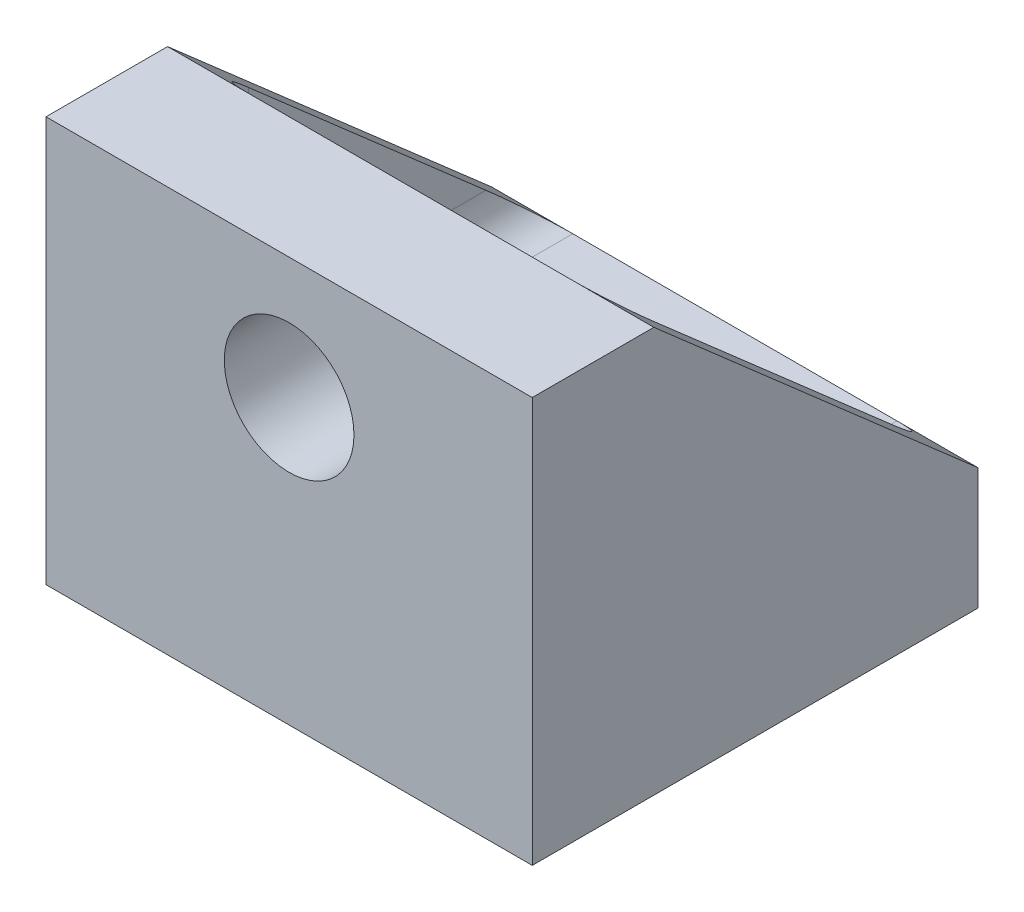
ISO-10303-21;
HEADER;
FILE_DESCRIPTION(('STEP AP214'),'2;1');
FILE_NAME('part.step','',(''),(''),'','','');
FILE_SCHEMA(('AUTOMOTIVE_DESIGN { 1 0 10303 214 1 1 1 1 }'));
ENDSEC;
DATA;
#1=APPLICATION_CONTEXT('core data for automotive mechanical design processes');
#2=APPLICATION_PROTOCOL_DEFINITION('international standard','automotive_design',2000,#1);
#3=PRODUCT_CONTEXT('',#1,'mechanical');
#4=PRODUCT('Part','Part','',(#3));
#5=PRODUCT_RELATED_PRODUCT_CATEGORY('part','',(#4));
#6=PRODUCT_DEFINITION_FORMATION('','',#4);
#7=PRODUCT_DEFINITION_CONTEXT('part definition',#1,'design');
#8=PRODUCT_DEFINITION('design','',#6,#7);
#9=PRODUCT_DEFINITION_SHAPE('','',#8);
#10=(LENGTH_UNIT() NAMED_UNIT(*) SI_UNIT(.MILLI.,.METRE.));
#11=(NAMED_UNIT(*) PLANE_ANGLE_UNIT() SI_UNIT($,.RADIAN.));
#12=(NAMED_UNIT(*) SI_UNIT($,.STERADIAN.) SOLID_ANGLE_UNIT());
#13=UNCERTAINTY_MEASURE_WITH_UNIT(LENGTH_MEASURE(1.E-05),#10,'distance_accuracy_value','');
#14=(GEOMETRIC_REPRESENTATION_CONTEXT(3) GLOBAL_UNCERTAINTY_ASSIGNED_CONTEXT((#13)) GLOBAL_UNIT_ASSIGNED_CONTEXT((#10,
#11,#12)) REPRESENTATION_CONTEXT('',''));
#15=CARTESIAN_POINT('',(0.,0.,0.));
#16=DIRECTION('',(0.,0.,1.));
#17=DIRECTION('',(1.,0.,0.));
#18=AXIS2_PLACEMENT_3D('',#15,#16,#17);
#19=CARTESIAN_POINT('',(0.,3.,0.));
#20=DIRECTION('',(0.,1.,0.));
#21=DIRECTION('',(0.,0.,1.));
#22=AXIS2_PLACEMENT_3D('',#19,#20,#21);
#23=PLANE('',#22);
#24=DIRECTION('',(-1.,0.,0.));
#25=VECTOR('',#24,1.);
#26=CARTESIAN_POINT('',(-5.,3.,-4.));
#27=LINE('',#26,#25);
#28=CARTESIAN_POINT('',(4.,3.,-4.));
#29=VERTEX_POINT('',#28);
#30=CARTESIAN_POINT('',(-4.,3.,-4.));
#31=VERTEX_POINT('',#30);
#32=EDGE_CURVE('E175',#29,#31,#27,.T.);
#33=ORIENTED_EDGE('',*,*,#32,.T.);
#34=DIRECTION('',(0.,0.,1.));
#35=VECTOR('',#34,1.);
#36=CARTESIAN_POINT('',(-4.,3.,3.));
#37=LINE('',#36,#35);
#38=CARTESIAN_POINT('',(-4.,3.,3.));
#39=VERTEX_POINT('',#38);
#40=EDGE_CURVE('E120',#31,#39,#37,.T.);
#41=ORIENTED_EDGE('',*,*,#40,.T.);
#42=DIRECTION('',(1.,0.,0.));
#43=VECTOR('',#42,1.);
#44=CARTESIAN_POINT('',(0.,3.,3.));
#45=LINE('',#44,#43);
#46=CARTESIAN_POINT('',(4.,3.,3.));
#47=VERTEX_POINT('',#46);
#48=EDGE_CURVE('E173',#39,#47,#45,.T.);
#49=ORIENTED_EDGE('',*,*,#48,.T.);
#50=DIRECTION('',(0.,0.,-1.));
#51=VECTOR('',#50,1.);
#52=CARTESIAN_POINT('',(4.,3.,-4.));
#53=LINE('',#52,#51);
#54=EDGE_CURVE('E156',#47,#29,#53,.T.);
#55=ORIENTED_EDGE('',*,*,#54,.T.);
#56=EDGE_LOOP('',(#33,#41,#49,#55));
#57=FACE_BOUND('',#56,.T.);
#58=CARTESIAN_POINT('',(0.,3.,-0.499999999999998));
#59=DIRECTION('',(0.,1.,0.));
#60=DIRECTION('',(0.,0.,1.));
#61=AXIS2_PLACEMENT_3D('',#58,#59,#60);
#62=CIRCLE('',#61,1.6);
#63=CARTESIAN_POINT('',(0.,3.,1.1));
#64=VERTEX_POINT('',#63);
#65=EDGE_CURVE('E179',#64,#64,#62,.T.);
#66=ORIENTED_EDGE('',*,*,#65,.F.);
#67=EDGE_LOOP('',(#66));
#68=FACE_BOUND('',#67,.T.);
#69=ADVANCED_FACE('F56',(#57,#68),#23,.T.);
#70=CARTESIAN_POINT('',(0.,0.,0.));
#71=DIRECTION('',(0.,1.,0.));
#72=DIRECTION('',(0.,0.,1.));
#73=AXIS2_PLACEMENT_3D('',#70,#71,#72);
#74=PLANE('',#73);
#75=DIRECTION('',(-1.,0.,0.));
#76=VECTOR('',#75,1.);
#77=CARTESIAN_POINT('',(-5.,0.,-4.));
#78=LINE('',#77,#76);
#79=CARTESIAN_POINT('',(6.,0.,-4.));
#80=VERTEX_POINT('',#79);
#81=CARTESIAN_POINT('',(-6.,0.,-4.));
#82=VERTEX_POINT('',#81);
#83=EDGE_CURVE('E176',#80,#82,#78,.T.);
#84=ORIENTED_EDGE('',*,*,#83,.F.);
#85=DIRECTION('',(0.,0.,1.));
#86=VECTOR('',#85,1.);
#87=CARTESIAN_POINT('',(6.,0.,-4.));
#88=LINE('',#87,#86);
#89=CARTESIAN_POINT('',(6.,0.,7.));
#90=VERTEX_POINT('',#89);
#91=EDGE_CURVE('E224',#80,#90,#88,.T.);
#92=ORIENTED_EDGE('',*,*,#91,.T.);
#93=DIRECTION('',(1.,0.,0.));
#94=VECTOR('',#93,1.);
#95=CARTESIAN_POINT('',(-5.,0.,7.));
#96=LINE('',#95,#94);
#97=CARTESIAN_POINT('',(-6.,0.,7.));
#98=VERTEX_POINT('',#97);
#99=EDGE_CURVE('E190',#98,#90,#96,.T.);
#100=ORIENTED_EDGE('',*,*,#99,.F.);
#101=DIRECTION('',(0.,0.,1.));
#102=VECTOR('',#101,1.);
#103=CARTESIAN_POINT('',(-6.,0.,-4.));
#104=LINE('',#103,#102);
#105=EDGE_CURVE('E216',#82,#98,#104,.T.);
#106=ORIENTED_EDGE('',*,*,#105,.F.);
#107=EDGE_LOOP('',(#84,#92,#100,#106));
#108=FACE_BOUND('',#107,.T.);
#109=CARTESIAN_POINT('',(0.,0.,-0.499999999999998));
#110=DIRECTION('',(0.,1.,0.));
#111=DIRECTION('',(0.,0.,1.));
#112=AXIS2_PLACEMENT_3D('',#109,#110,#111);
#113=CIRCLE('',#112,1.6);
#114=CARTESIAN_POINT('',(0.,0.,1.1));
#115=VERTEX_POINT('',#114);
#116=EDGE_CURVE('E181',#115,#115,#113,.T.);
#117=ORIENTED_EDGE('',*,*,#116,.T.);
#118=EDGE_LOOP('',(#117));
#119=FACE_BOUND('',#118,.T.);
#120=ADVANCED_FACE('F256',(#108,#119),#74,.F.);
#121=CARTESIAN_POINT('',(-5.,3.,-4.));
#122=DIRECTION('',(0.,0.,1.));
#123=DIRECTION('',(1.,0.,0.));
#124=AXIS2_PLACEMENT_3D('',#121,#122,#123);
#125=PLANE('',#124);
#126=ORIENTED_EDGE('',*,*,#83,.T.);
#127=DIRECTION('',(0.,-1.,0.));
#128=VECTOR('',#127,1.);
#129=CARTESIAN_POINT('',(-6.,0.,-4.));
#130=LINE('',#129,#128);
#131=CARTESIAN_POINT('',(-6.,3.,-4.));
#132=VERTEX_POINT('',#131);
#133=EDGE_CURVE('E207',#132,#82,#130,.T.);
#134=ORIENTED_EDGE('',*,*,#133,.F.);
#135=DIRECTION('',(1.,0.,0.));
#136=VECTOR('',#135,1.);
#137=CARTESIAN_POINT('',(-6.,3.,-4.));
#138=LINE('',#137,#136);
#139=EDGE_CURVE('E75',#132,#31,#138,.T.);
#140=ORIENTED_EDGE('',*,*,#139,.T.);
#141=ORIENTED_EDGE('',*,*,#32,.F.);
#142=DIRECTION('',(-1.,0.,0.));
#143=VECTOR('',#142,1.);
#144=CARTESIAN_POINT('',(6.,3.,-4.));
#145=LINE('',#144,#143);
#146=CARTESIAN_POINT('',(6.,3.,-4.));
#147=VERTEX_POINT('',#146);
#148=EDGE_CURVE('E89',#147,#29,#145,.T.);
#149=ORIENTED_EDGE('',*,*,#148,.F.);
#150=DIRECTION('',(0.,-1.,0.));
#151=VECTOR('',#150,1.);
#152=CARTESIAN_POINT('',(6.,0.,-4.));
#153=LINE('',#152,#151);
#154=EDGE_CURVE('E227',#147,#80,#153,.T.);
#155=ORIENTED_EDGE('',*,*,#154,.T.);
#156=EDGE_LOOP('',(#126,#134,#140,#141,#149,#155));
#157=FACE_BOUND('',#156,.T.);
#158=ADVANCED_FACE('F242',(#157),#125,.F.);
#159=CARTESIAN_POINT('',(0.,3.,-0.499999999999998));
#160=DIRECTION('',(0.,-1.,0.));
#161=DIRECTION('',(0.,0.,-1.));
#162=AXIS2_PLACEMENT_3D('',#159,#160,#161);
#163=CYLINDRICAL_SURFACE('',#162,1.6);
#164=ORIENTED_EDGE('',*,*,#65,.T.);
#165=EDGE_LOOP('',(#164));
#166=FACE_BOUND('',#165,.T.);
#167=ORIENTED_EDGE('',*,*,#116,.F.);
#168=EDGE_LOOP('',(#167));
#169=FACE_BOUND('',#168,.T.);
#170=ADVANCED_FACE('F329',(#166,#169),#163,.F.);
#171=CARTESIAN_POINT('',(0.,0.,7.));
#172=DIRECTION('',(0.,0.,1.));
#173=DIRECTION('',(1.,0.,0.));
#174=AXIS2_PLACEMENT_3D('',#171,#172,#173);
#175=PLANE('',#174);
#176=ORIENTED_EDGE('',*,*,#99,.T.);
#177=DIRECTION('',(0.,1.,0.));
#178=VECTOR('',#177,1.);
#179=CARTESIAN_POINT('',(6.,0.,7.));
#180=LINE('',#179,#178);
#181=CARTESIAN_POINT('',(6.,10.,7.));
#182=VERTEX_POINT('',#181);
#183=EDGE_CURVE('E230',#90,#182,#180,.T.);
#184=ORIENTED_EDGE('',*,*,#183,.T.);
#185=DIRECTION('',(1.,0.,0.));
#186=VECTOR('',#185,1.);
#187=CARTESIAN_POINT('',(-5.,10.,7.));
#188=LINE('',#187,#186);
#189=CARTESIAN_POINT('',(-6.,10.,7.));
#190=VERTEX_POINT('',#189);
#191=EDGE_CURVE('E184',#190,#182,#188,.T.);
#192=ORIENTED_EDGE('',*,*,#191,.F.);
#193=DIRECTION('',(0.,1.,0.));
#194=VECTOR('',#193,1.);
#195=CARTESIAN_POINT('',(-6.,0.,7.));
#196=LINE('',#195,#194);
#197=EDGE_CURVE('E213',#98,#190,#196,.T.);
#198=ORIENTED_EDGE('',*,*,#197,.F.);
#199=EDGE_LOOP('',(#176,#184,#192,#198));
#200=FACE_BOUND('',#199,.T.);
#201=CARTESIAN_POINT('',(0.,7.,7.));
#202=DIRECTION('',(0.,0.,1.));
#203=DIRECTION('',(1.,0.,0.));
#204=AXIS2_PLACEMENT_3D('',#201,#202,#203);
#205=CIRCLE('',#204,1.6);
#206=CARTESIAN_POINT('',(1.6,7.,7.));
#207=VERTEX_POINT('',#206);
#208=EDGE_CURVE('E191',#207,#207,#205,.T.);
#209=ORIENTED_EDGE('',*,*,#208,.F.);
#210=EDGE_LOOP('',(#209));
#211=FACE_BOUND('',#210,.T.);
#212=ADVANCED_FACE('F299',(#200,#211),#175,.T.);
#213=CARTESIAN_POINT('',(0.,0.,4.));
#214=DIRECTION('',(0.,0.,1.));
#215=DIRECTION('',(1.,0.,0.));
#216=AXIS2_PLACEMENT_3D('',#213,#214,#215);
#217=PLANE('',#216);
#218=DIRECTION('',(1.,0.,0.));
#219=VECTOR('',#218,1.);
#220=CARTESIAN_POINT('',(-5.,10.,4.));
#221=LINE('',#220,#219);
#222=CARTESIAN_POINT('',(-4.,10.,4.));
#223=VERTEX_POINT('',#222);
#224=CARTESIAN_POINT('',(4.,10.,4.));
#225=VERTEX_POINT('',#224);
#226=EDGE_CURVE('E187',#223,#225,#221,.T.);
#227=ORIENTED_EDGE('',*,*,#226,.T.);
#228=DIRECTION('',(0.,1.,0.));
#229=VECTOR('',#228,1.);
#230=CARTESIAN_POINT('',(4.,0.,4.));
#231=LINE('',#230,#229);
#232=CARTESIAN_POINT('',(4.,4.,4.));
#233=VERTEX_POINT('',#232);
#234=EDGE_CURVE('E160',#225,#233,#231,.F.);
#235=ORIENTED_EDGE('',*,*,#234,.T.);
#236=DIRECTION('',(1.,0.,0.));
#237=VECTOR('',#236,1.);
#238=CARTESIAN_POINT('',(0.,4.,4.));
#239=LINE('',#238,#237);
#240=CARTESIAN_POINT('',(-4.,4.,4.));
#241=VERTEX_POINT('',#240);
#242=EDGE_CURVE('E170',#233,#241,#239,.F.);
#243=ORIENTED_EDGE('',*,*,#242,.T.);
#244=DIRECTION('',(0.,1.,0.));
#245=VECTOR('',#244,1.);
#246=CARTESIAN_POINT('',(-4.,0.,4.));
#247=LINE('',#246,#245);
#248=EDGE_CURVE('E126',#241,#223,#247,.T.);
#249=ORIENTED_EDGE('',*,*,#248,.T.);
#250=EDGE_LOOP('',(#227,#235,#243,#249));
#251=FACE_BOUND('',#250,.T.);
#252=CARTESIAN_POINT('',(0.,7.,4.));
#253=DIRECTION('',(0.,0.,1.));
#254=DIRECTION('',(1.,0.,0.));
#255=AXIS2_PLACEMENT_3D('',#252,#253,#254);
#256=CIRCLE('',#255,1.6);
#257=CARTESIAN_POINT('',(1.6,7.,4.));
#258=VERTEX_POINT('',#257);
#259=EDGE_CURVE('E196',#258,#258,#256,.T.);
#260=ORIENTED_EDGE('',*,*,#259,.T.);
#261=EDGE_LOOP('',(#260));
#262=FACE_BOUND('',#261,.T.);
#263=ADVANCED_FACE('F292',(#251,#262),#217,.F.);
#264=CARTESIAN_POINT('',(-5.,10.,7.));
#265=DIRECTION('',(0.,1.,0.));
#266=DIRECTION('',(0.,0.,1.));
#267=AXIS2_PLACEMENT_3D('',#264,#265,#266);
#268=PLANE('',#267);
#269=ORIENTED_EDGE('',*,*,#226,.F.);
#270=DIRECTION('',(1.,0.,0.));
#271=VECTOR('',#270,1.);
#272=CARTESIAN_POINT('',(-6.,10.,4.));
#273=LINE('',#272,#271);
#274=CARTESIAN_POINT('',(-6.,10.,4.));
#275=VERTEX_POINT('',#274);
#276=EDGE_CURVE('E199',#275,#223,#273,.T.);
#277=ORIENTED_EDGE('',*,*,#276,.F.);
#278=DIRECTION('',(0.,0.,-1.));
#279=VECTOR('',#278,1.);
#280=CARTESIAN_POINT('',(-6.,10.,4.));
#281=LINE('',#280,#279);
#282=EDGE_CURVE('E210',#190,#275,#281,.T.);
#283=ORIENTED_EDGE('',*,*,#282,.F.);
#284=ORIENTED_EDGE('',*,*,#191,.T.);
#285=DIRECTION('',(0.,0.,-1.));
#286=VECTOR('',#285,1.);
#287=CARTESIAN_POINT('',(6.,10.,4.));
#288=LINE('',#287,#286);
#289=CARTESIAN_POINT('',(6.,10.,4.));
#290=VERTEX_POINT('',#289);
#291=EDGE_CURVE('E233',#182,#290,#288,.T.);
#292=ORIENTED_EDGE('',*,*,#291,.T.);
#293=DIRECTION('',(-1.,0.,0.));
#294=VECTOR('',#293,1.);
#295=CARTESIAN_POINT('',(6.,10.,4.));
#296=LINE('',#295,#294);
#297=EDGE_CURVE('E222',#290,#225,#296,.T.);
#298=ORIENTED_EDGE('',*,*,#297,.T.);
#299=EDGE_LOOP('',(#269,#277,#283,#284,#292,#298));
#300=FACE_BOUND('',#299,.T.);
#301=ADVANCED_FACE('F294',(#300),#268,.T.);
#302=CARTESIAN_POINT('',(0.,7.,7.));
#303=DIRECTION('',(0.,0.,-1.));
#304=DIRECTION('',(-1.,0.,0.));
#305=AXIS2_PLACEMENT_3D('',#302,#303,#304);
#306=CYLINDRICAL_SURFACE('',#305,1.6);
#307=ORIENTED_EDGE('',*,*,#208,.T.);
#308=EDGE_LOOP('',(#307));
#309=FACE_BOUND('',#308,.T.);
#310=ORIENTED_EDGE('',*,*,#259,.F.);
#311=EDGE_LOOP('',(#310));
#312=FACE_BOUND('',#311,.T.);
#313=ADVANCED_FACE('F348',(#309,#312),#306,.F.);
#314=CARTESIAN_POINT('',(-5.,0.,0.));
#315=DIRECTION('',(1.,0.,0.));
#316=DIRECTION('',(0.,0.,-1.));
#317=AXIS2_PLACEMENT_3D('',#314,#315,#316);
#318=PLANE('',#317);
#319=DIRECTION('',(0.,1.,0.));
#320=VECTOR('',#319,1.);
#321=CARTESIAN_POINT('',(-5.,0.,3.));
#322=LINE('',#321,#320);
#323=CARTESIAN_POINT('',(-5.,9.125,3.));
#324=VERTEX_POINT('',#323);
#325=CARTESIAN_POINT('',(-5.,4.,3.));
#326=VERTEX_POINT('',#325);
#327=EDGE_CURVE('E111',#324,#326,#322,.F.);
#328=ORIENTED_EDGE('',*,*,#327,.T.);
#329=DIRECTION('',(0.,0.,1.));
#330=VECTOR('',#329,1.);
#331=CARTESIAN_POINT('',(-5.,4.,-4.));
#332=LINE('',#331,#330);
#333=CARTESIAN_POINT('',(-5.,4.,-2.85714285714286));
#334=VERTEX_POINT('',#333);
#335=EDGE_CURVE('E115',#326,#334,#332,.F.);
#336=ORIENTED_EDGE('',*,*,#335,.T.);
#337=DIRECTION('',(0.,-0.658504607868518,-0.752576694706878));
#338=VECTOR('',#337,1.);
#339=CARTESIAN_POINT('',(-5.,3.,-4.));
#340=LINE('',#339,#338);
#341=EDGE_CURVE('E117',#324,#334,#340,.T.);
#342=ORIENTED_EDGE('',*,*,#341,.F.);
#343=EDGE_LOOP('',(#328,#336,#342));
#344=FACE_BOUND('',#343,.T.);
#345=ADVANCED_FACE('F113',(#344),#318,.T.);
#346=CARTESIAN_POINT('',(-6.,3.,-4.));
#347=DIRECTION('',(0.,-0.752576694706878,0.658504607868518));
#348=DIRECTION('',(0.,-0.658504607868518,-0.752576694706878));
#349=AXIS2_PLACEMENT_3D('',#346,#347,#348);
#350=PLANE('',#349);
#351=ORIENTED_EDGE('',*,*,#276,.T.);
#352=CARTESIAN_POINT('',(-4.,9.125,3.));
#353=DIRECTION('',(0.,-0.752576694706878,0.658504607868518));
#354=DIRECTION('',(0.,0.658504607868518,0.752576694706878));
#355=AXIS2_PLACEMENT_3D('',#352,#353,#354);
#356=ELLIPSE('',#355,1.32876822659183,1.);
#357=EDGE_CURVE('E12',#223,#324,#356,.T.);
#358=ORIENTED_EDGE('',*,*,#357,.T.);
#359=ORIENTED_EDGE('',*,*,#341,.T.);
#360=CARTESIAN_POINT('',(-4.,4.,-2.85714285714286));
#361=DIRECTION('',(0.,-0.752576694706878,0.658504607868518));
#362=DIRECTION('',(0.,-0.658504607868518,-0.752576694706878));
#363=AXIS2_PLACEMENT_3D('',#360,#361,#362);
#364=ELLIPSE('',#363,1.51859225896209,1.);
#365=EDGE_CURVE('E137',#334,#31,#364,.T.);
#366=ORIENTED_EDGE('',*,*,#365,.T.);
#367=ORIENTED_EDGE('',*,*,#139,.F.);
#368=DIRECTION('',(0.,-0.658504607868518,-0.752576694706878));
#369=VECTOR('',#368,1.);
#370=CARTESIAN_POINT('',(-6.,3.,-4.));
#371=LINE('',#370,#369);
#372=EDGE_CURVE('E205',#275,#132,#371,.T.);
#373=ORIENTED_EDGE('',*,*,#372,.F.);
#374=EDGE_LOOP('',(#351,#358,#359,#366,#367,#373));
#375=FACE_BOUND('',#374,.T.);
#376=ADVANCED_FACE('F287',(#375),#350,.F.);
#377=CARTESIAN_POINT('',(-6.,0.,0.));
#378=DIRECTION('',(1.,0.,0.));
#379=DIRECTION('',(0.,0.,-1.));
#380=AXIS2_PLACEMENT_3D('',#377,#378,#379);
#381=PLANE('',#380);
#382=ORIENTED_EDGE('',*,*,#133,.T.);
#383=ORIENTED_EDGE('',*,*,#105,.T.);
#384=ORIENTED_EDGE('',*,*,#197,.T.);
#385=ORIENTED_EDGE('',*,*,#282,.T.);
#386=ORIENTED_EDGE('',*,*,#372,.T.);
#387=EDGE_LOOP('',(#382,#383,#384,#385,#386));
#388=FACE_BOUND('',#387,.T.);
#389=ADVANCED_FACE('F302',(#388),#381,.F.);
#390=CARTESIAN_POINT('',(5.,0.,0.));
#391=DIRECTION('',(-1.,0.,0.));
#392=DIRECTION('',(0.,0.,-1.));
#393=AXIS2_PLACEMENT_3D('',#390,#391,#392);
#394=PLANE('',#393);
#395=DIRECTION('',(0.,0.,-1.));
#396=VECTOR('',#395,1.);
#397=CARTESIAN_POINT('',(5.,4.,3.));
#398=LINE('',#397,#396);
#399=CARTESIAN_POINT('',(5.,4.,-2.85714285714286));
#400=VERTEX_POINT('',#399);
#401=CARTESIAN_POINT('',(5.,4.,3.));
#402=VERTEX_POINT('',#401);
#403=EDGE_CURVE('E167',#400,#402,#398,.F.);
#404=ORIENTED_EDGE('',*,*,#403,.T.);
#405=DIRECTION('',(0.,1.,0.));
#406=VECTOR('',#405,1.);
#407=CARTESIAN_POINT('',(5.,0.,3.));
#408=LINE('',#407,#406);
#409=CARTESIAN_POINT('',(5.,9.125,3.));
#410=VERTEX_POINT('',#409);
#411=EDGE_CURVE('E164',#402,#410,#408,.T.);
#412=ORIENTED_EDGE('',*,*,#411,.T.);
#413=DIRECTION('',(0.,-0.658504607868518,-0.752576694706878));
#414=VECTOR('',#413,1.);
#415=CARTESIAN_POINT('',(5.,3.,-4.));
#416=LINE('',#415,#414);
#417=EDGE_CURVE('E148',#410,#400,#416,.T.);
#418=ORIENTED_EDGE('',*,*,#417,.T.);
#419=EDGE_LOOP('',(#404,#412,#418));
#420=FACE_BOUND('',#419,.T.);
#421=ADVANCED_FACE('F367',(#420),#394,.T.);
#422=CARTESIAN_POINT('',(6.,3.,-4.));
#423=DIRECTION('',(0.,0.752576694706878,-0.658504607868518));
#424=DIRECTION('',(0.,0.658504607868518,0.752576694706878));
#425=AXIS2_PLACEMENT_3D('',#422,#423,#424);
#426=PLANE('',#425);
#427=ORIENTED_EDGE('',*,*,#417,.F.);
#428=CARTESIAN_POINT('',(4.,9.125,3.));
#429=DIRECTION('',(0.,0.752576694706878,-0.658504607868518));
#430=DIRECTION('',(0.,0.658504607868518,0.752576694706878));
#431=AXIS2_PLACEMENT_3D('',#428,#429,#430);
#432=ELLIPSE('',#431,1.32876822659183,1.);
#433=EDGE_CURVE('E138',#410,#225,#432,.F.);
#434=ORIENTED_EDGE('',*,*,#433,.T.);
#435=ORIENTED_EDGE('',*,*,#297,.F.);
#436=DIRECTION('',(0.,-0.658504607868518,-0.752576694706878));
#437=VECTOR('',#436,1.);
#438=CARTESIAN_POINT('',(6.,3.,-4.));
#439=LINE('',#438,#437);
#440=EDGE_CURVE('E236',#290,#147,#439,.T.);
#441=ORIENTED_EDGE('',*,*,#440,.T.);
#442=ORIENTED_EDGE('',*,*,#148,.T.);
#443=CARTESIAN_POINT('',(4.,4.,-2.85714285714286));
#444=DIRECTION('',(0.,0.752576694706878,-0.658504607868518));
#445=DIRECTION('',(0.,0.658504607868518,0.752576694706878));
#446=AXIS2_PLACEMENT_3D('',#443,#444,#445);
#447=ELLIPSE('',#446,1.51859225896209,1.);
#448=EDGE_CURVE('E66',#29,#400,#447,.F.);
#449=ORIENTED_EDGE('',*,*,#448,.T.);
#450=EDGE_LOOP('',(#427,#434,#435,#441,#442,#449));
#451=FACE_BOUND('',#450,.T.);
#452=ADVANCED_FACE('F297',(#451),#426,.T.);
#453=CARTESIAN_POINT('',(6.,0.,0.));
#454=DIRECTION('',(-1.,0.,0.));
#455=DIRECTION('',(0.,0.,-1.));
#456=AXIS2_PLACEMENT_3D('',#453,#454,#455);
#457=PLANE('',#456);
#458=ORIENTED_EDGE('',*,*,#154,.F.);
#459=ORIENTED_EDGE('',*,*,#440,.F.);
#460=ORIENTED_EDGE('',*,*,#291,.F.);
#461=ORIENTED_EDGE('',*,*,#183,.F.);
#462=ORIENTED_EDGE('',*,*,#91,.F.);
#463=EDGE_LOOP('',(#458,#459,#460,#461,#462));
#464=FACE_BOUND('',#463,.T.);
#465=ADVANCED_FACE('F252',(#464),#457,.F.);
#466=CARTESIAN_POINT('',(0.,4.,3.));
#467=DIRECTION('',(1.,0.,0.));
#468=DIRECTION('',(0.,0.,-1.));
#469=AXIS2_PLACEMENT_3D('',#466,#467,#468);
#470=CYLINDRICAL_SURFACE('',#469,1.);
#471=ORIENTED_EDGE('',*,*,#242,.F.);
#472=CARTESIAN_POINT('',(4.,4.,3.));
#473=DIRECTION('',(1.,0.,0.));
#474=DIRECTION('',(0.,0.,-1.));
#475=AXIS2_PLACEMENT_3D('',#472,#473,#474);
#476=CIRCLE('',#475,1.);
#477=EDGE_CURVE('E100',#233,#47,#476,.T.);
#478=ORIENTED_EDGE('',*,*,#477,.T.);
#479=ORIENTED_EDGE('',*,*,#48,.F.);
#480=CARTESIAN_POINT('',(-4.,4.,3.));
#481=DIRECTION('',(1.,0.,0.));
#482=DIRECTION('',(0.,0.,-1.));
#483=AXIS2_PLACEMENT_3D('',#480,#481,#482);
#484=CIRCLE('',#483,1.);
#485=EDGE_CURVE('E142',#39,#241,#484,.F.);
#486=ORIENTED_EDGE('',*,*,#485,.T.);
#487=EDGE_LOOP('',(#471,#478,#479,#486));
#488=FACE_BOUND('',#487,.T.);
#489=ADVANCED_FACE('F306',(#488),#470,.F.);
#490=CARTESIAN_POINT('',(4.,4.,0.));
#491=DIRECTION('',(0.,0.,1.));
#492=DIRECTION('',(1.,0.,0.));
#493=AXIS2_PLACEMENT_3D('',#490,#491,#492);
#494=CYLINDRICAL_SURFACE('',#493,1.);
#495=ORIENTED_EDGE('',*,*,#448,.F.);
#496=ORIENTED_EDGE('',*,*,#54,.F.);
#497=CARTESIAN_POINT('',(4.,4.,3.));
#498=DIRECTION('',(0.,0.,-1.));
#499=DIRECTION('',(-1.,0.,0.));
#500=AXIS2_PLACEMENT_3D('',#497,#498,#499);
#501=CIRCLE('',#500,1.);
#502=EDGE_CURVE('E145',#402,#47,#501,.T.);
#503=ORIENTED_EDGE('',*,*,#502,.F.);
#504=ORIENTED_EDGE('',*,*,#403,.F.);
#505=EDGE_LOOP('',(#495,#496,#503,#504));
#506=FACE_BOUND('',#505,.T.);
#507=ADVANCED_FACE('F308',(#506),#494,.F.);
#508=CARTESIAN_POINT('',(4.,4.,3.));
#509=DIRECTION('',(-1.,0.,0.));
#510=DIRECTION('',(0.,0.,1.));
#511=AXIS2_PLACEMENT_3D('',#508,#509,#510);
#512=SPHERICAL_SURFACE('',#511,1.);
#513=ORIENTED_EDGE('',*,*,#502,.T.);
#514=ORIENTED_EDGE('',*,*,#477,.F.);
#515=CARTESIAN_POINT('',(4.,4.,3.));
#516=DIRECTION('',(0.,-1.,0.));
#517=DIRECTION('',(0.,0.,-1.));
#518=AXIS2_PLACEMENT_3D('',#515,#516,#517);
#519=CIRCLE('',#518,1.);
#520=EDGE_CURVE('E130',#402,#233,#519,.T.);
#521=ORIENTED_EDGE('',*,*,#520,.F.);
#522=EDGE_LOOP('',(#513,#514,#521));
#523=FACE_BOUND('',#522,.T.);
#524=ADVANCED_FACE('F314',(#523),#512,.F.);
#525=CARTESIAN_POINT('',(4.,0.,3.));
#526=DIRECTION('',(0.,1.,0.));
#527=DIRECTION('',(0.,0.,1.));
#528=AXIS2_PLACEMENT_3D('',#525,#526,#527);
#529=CYLINDRICAL_SURFACE('',#528,1.);
#530=ORIENTED_EDGE('',*,*,#520,.T.);
#531=ORIENTED_EDGE('',*,*,#234,.F.);
#532=ORIENTED_EDGE('',*,*,#433,.F.);
#533=ORIENTED_EDGE('',*,*,#411,.F.);
#534=EDGE_LOOP('',(#530,#531,#532,#533));
#535=FACE_BOUND('',#534,.T.);
#536=ADVANCED_FACE('F380',(#535),#529,.F.);
#537=CARTESIAN_POINT('',(-4.,0.,3.));
#538=DIRECTION('',(0.,1.,0.));
#539=DIRECTION('',(0.,0.,1.));
#540=AXIS2_PLACEMENT_3D('',#537,#538,#539);
#541=CYLINDRICAL_SURFACE('',#540,1.);
#542=ORIENTED_EDGE('',*,*,#357,.F.);
#543=ORIENTED_EDGE('',*,*,#248,.F.);
#544=CARTESIAN_POINT('',(-4.,4.,3.));
#545=DIRECTION('',(0.,1.,0.));
#546=DIRECTION('',(0.,0.,1.));
#547=AXIS2_PLACEMENT_3D('',#544,#545,#546);
#548=CIRCLE('',#547,1.);
#549=EDGE_CURVE('E60',#326,#241,#548,.T.);
#550=ORIENTED_EDGE('',*,*,#549,.F.);
#551=ORIENTED_EDGE('',*,*,#327,.F.);
#552=EDGE_LOOP('',(#542,#543,#550,#551));
#553=FACE_BOUND('',#552,.T.);
#554=ADVANCED_FACE('F58',(#553),#541,.F.);
#555=CARTESIAN_POINT('',(-4.,4.,3.));
#556=DIRECTION('',(1.,0.,0.));
#557=DIRECTION('',(0.,0.,-1.));
#558=AXIS2_PLACEMENT_3D('',#555,#556,#557);
#559=SPHERICAL_SURFACE('',#558,1.);
#560=ORIENTED_EDGE('',*,*,#549,.T.);
#561=ORIENTED_EDGE('',*,*,#485,.F.);
#562=CARTESIAN_POINT('',(-4.,4.,3.));
#563=DIRECTION('',(0.,0.,1.));
#564=DIRECTION('',(1.,0.,0.));
#565=AXIS2_PLACEMENT_3D('',#562,#563,#564);
#566=CIRCLE('',#565,1.);
#567=EDGE_CURVE('E131',#326,#39,#566,.T.);
#568=ORIENTED_EDGE('',*,*,#567,.F.);
#569=EDGE_LOOP('',(#560,#561,#568));
#570=FACE_BOUND('',#569,.T.);
#571=ADVANCED_FACE('F140',(#570),#559,.F.);
#572=CARTESIAN_POINT('',(-4.,4.,0.));
#573=DIRECTION('',(0.,0.,-1.));
#574=DIRECTION('',(-1.,0.,0.));
#575=AXIS2_PLACEMENT_3D('',#572,#573,#574);
#576=CYLINDRICAL_SURFACE('',#575,1.);
#577=ORIENTED_EDGE('',*,*,#365,.F.);
#578=ORIENTED_EDGE('',*,*,#335,.F.);
#579=ORIENTED_EDGE('',*,*,#567,.T.);
#580=ORIENTED_EDGE('',*,*,#40,.F.);
#581=EDGE_LOOP('',(#577,#578,#579,#580));
#582=FACE_BOUND('',#581,.T.);
#583=ADVANCED_FACE('F134',(#582),#576,.F.);
#584=CLOSED_SHELL('',(#69,#120,#158,#170,#212,#263,#301,#313,#345,#376,#389,#421,#452,#465,#489,
#507,#524,#536,#554,#571,#583));
#585=MANIFOLD_SOLID_BREP('B2',#584);
#586=ADVANCED_BREP_SHAPE_REPRESENTATION('',(#18,#585),#14);
#587=SHAPE_DEFINITION_REPRESENTATION(#9,#586);
ENDSEC;
END-ISO-10303-21;
